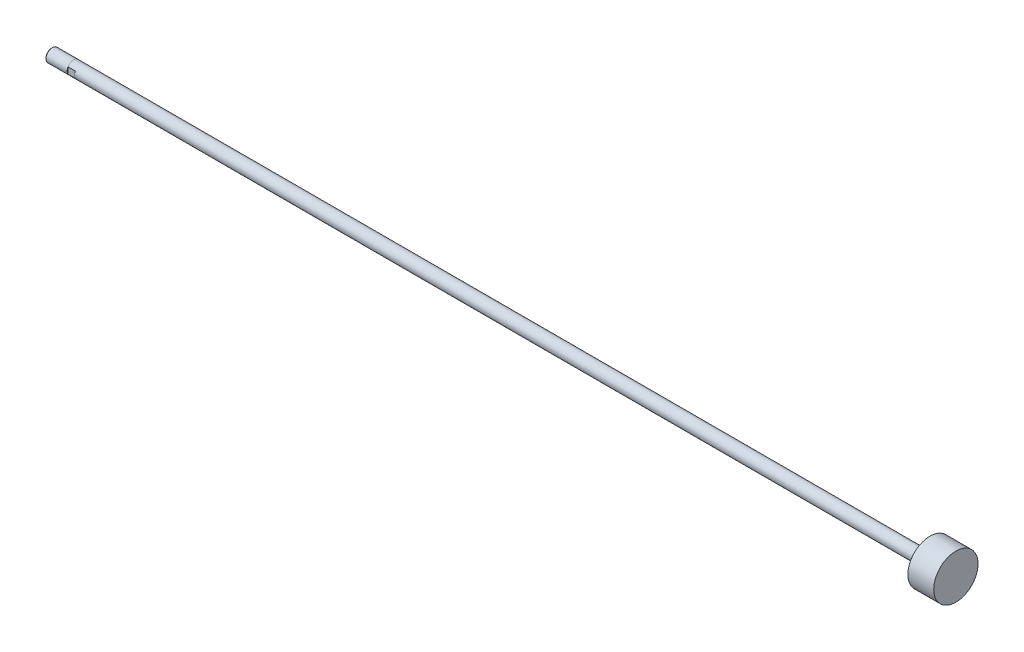
ISO-10303-21;
HEADER;
FILE_DESCRIPTION(('STEP AP214'),'2;1');
FILE_NAME('part.step','',(''),(''),'','','');
FILE_SCHEMA(('AUTOMOTIVE_DESIGN { 1 0 10303 214 1 1 1 1 }'));
ENDSEC;
DATA;
#1=APPLICATION_CONTEXT('core data for automotive mechanical design processes');
#2=APPLICATION_PROTOCOL_DEFINITION('international standard','automotive_design',2000,#1);
#3=PRODUCT_CONTEXT('',#1,'mechanical');
#4=PRODUCT('Part','Part','',(#3));
#5=PRODUCT_RELATED_PRODUCT_CATEGORY('part','',(#4));
#6=PRODUCT_DEFINITION_FORMATION('','',#4);
#7=PRODUCT_DEFINITION_CONTEXT('part definition',#1,'design');
#8=PRODUCT_DEFINITION('design','',#6,#7);
#9=PRODUCT_DEFINITION_SHAPE('','',#8);
#10=(LENGTH_UNIT() NAMED_UNIT(*) SI_UNIT(.MILLI.,.METRE.));
#11=(NAMED_UNIT(*) PLANE_ANGLE_UNIT() SI_UNIT($,.RADIAN.));
#12=(NAMED_UNIT(*) SI_UNIT($,.STERADIAN.) SOLID_ANGLE_UNIT());
#13=UNCERTAINTY_MEASURE_WITH_UNIT(LENGTH_MEASURE(1.E-05),#10,'distance_accuracy_value','');
#14=(GEOMETRIC_REPRESENTATION_CONTEXT(3) GLOBAL_UNCERTAINTY_ASSIGNED_CONTEXT((#13)) GLOBAL_UNIT_ASSIGNED_CONTEXT((#10,
#11,#12)) REPRESENTATION_CONTEXT('',''));
#15=CARTESIAN_POINT('',(0.,0.,0.));
#16=DIRECTION('',(0.,0.,1.));
#17=DIRECTION('',(1.,0.,0.));
#18=AXIS2_PLACEMENT_3D('',#15,#16,#17);
#19=CARTESIAN_POINT('',(-25.4,0.,0.));
#20=DIRECTION('',(1.,0.,0.));
#21=DIRECTION('',(0.,0.,-1.));
#22=AXIS2_PLACEMENT_3D('',#19,#20,#21);
#23=PLANE('',#22);
#24=CARTESIAN_POINT('',(-25.3999999999905,0.,0.));
#25=DIRECTION('',(1.,0.,0.));
#26=DIRECTION('',(0.,0.,-1.));
#27=AXIS2_PLACEMENT_3D('',#24,#25,#26);
#28=CIRCLE('',#27,4.80060000006688);
#29=CARTESIAN_POINT('',(-25.3999999999905,0.,-4.80060000006688));
#30=VERTEX_POINT('',#29);
#31=EDGE_CURVE('E20',#30,#30,#28,.T.);
#32=ORIENTED_EDGE('',*,*,#31,.F.);
#33=EDGE_LOOP('',(#32));
#34=FACE_BOUND('',#33,.T.);
#35=ADVANCED_FACE('F17',(#34),#23,.F.);
#36=CARTESIAN_POINT('',(755.777,19.14525,0.));
#37=DIRECTION('',(-1.,0.,0.));
#38=DIRECTION('',(0.,0.,1.));
#39=AXIS2_PLACEMENT_3D('',#36,#37,#38);
#40=PLANE('',#39);
#41=CARTESIAN_POINT('',(755.777,0.,0.));
#42=DIRECTION('',(-1.,0.,0.));
#43=DIRECTION('',(0.,0.,1.));
#44=AXIS2_PLACEMENT_3D('',#41,#42,#43);
#45=CIRCLE('',#44,19.14525);
#46=CARTESIAN_POINT('',(755.777,0.,19.14525));
#47=VERTEX_POINT('',#46);
#48=EDGE_CURVE('E92',#47,#47,#45,.T.);
#49=ORIENTED_EDGE('',*,*,#48,.F.);
#50=EDGE_LOOP('',(#49));
#51=FACE_BOUND('',#50,.T.);
#52=ADVANCED_FACE('F105',(#51),#40,.F.);
#53=CARTESIAN_POINT('',(-24.6443500000169,0.,0.));
#54=DIRECTION('',(1.,0.,0.));
#55=DIRECTION('',(0.,0.,-1.));
#56=AXIS2_PLACEMENT_3D('',#53,#54,#55);
#57=CONICAL_SURFACE('',#56,5.55625000004056,0.785398163397448);
#58=ORIENTED_EDGE('',*,*,#31,.T.);
#59=EDGE_LOOP('',(#58));
#60=FACE_BOUND('',#59,.T.);
#61=CARTESIAN_POINT('',(-24.64435,0.,0.));
#62=DIRECTION('',(-1.,0.,0.));
#63=DIRECTION('',(0.,0.,1.));
#64=AXIS2_PLACEMENT_3D('',#61,#62,#63);
#65=CIRCLE('',#64,5.55625);
#66=CARTESIAN_POINT('',(-24.64435,0.,5.55625));
#67=VERTEX_POINT('',#66);
#68=EDGE_CURVE('E91',#67,#67,#65,.F.);
#69=ORIENTED_EDGE('',*,*,#68,.F.);
#70=EDGE_LOOP('',(#69));
#71=FACE_BOUND('',#70,.T.);
#72=ADVANCED_FACE('F101',(#60,#71),#57,.T.);
#73=CARTESIAN_POINT('',(755.777,0.,0.));
#74=DIRECTION('',(-1.,0.,0.));
#75=DIRECTION('',(0.,0.,1.));
#76=AXIS2_PLACEMENT_3D('',#73,#74,#75);
#77=CYLINDRICAL_SURFACE('',#76,19.14525);
#78=CARTESIAN_POINT('',(733.425,0.,0.));
#79=DIRECTION('',(-1.,0.,0.));
#80=DIRECTION('',(0.,0.,1.));
#81=AXIS2_PLACEMENT_3D('',#78,#79,#80);
#82=CIRCLE('',#81,19.14525);
#83=CARTESIAN_POINT('',(733.425,0.,19.14525));
#84=VERTEX_POINT('',#83);
#85=EDGE_CURVE('E89',#84,#84,#82,.F.);
#86=ORIENTED_EDGE('',*,*,#85,.T.);
#87=EDGE_LOOP('',(#86));
#88=FACE_BOUND('',#87,.T.);
#89=ORIENTED_EDGE('',*,*,#48,.T.);
#90=EDGE_LOOP('',(#89));
#91=FACE_BOUND('',#90,.T.);
#92=ADVANCED_FACE('F139',(#88,#91),#77,.T.);
#93=CARTESIAN_POINT('',(-6.35,0.,0.));
#94=DIRECTION('',(-1.,0.,0.));
#95=DIRECTION('',(0.,0.,1.));
#96=AXIS2_PLACEMENT_3D('',#93,#94,#95);
#97=CYLINDRICAL_SURFACE('',#96,5.55625);
#98=ORIENTED_EDGE('',*,*,#68,.T.);
#99=EDGE_LOOP('',(#98));
#100=FACE_BOUND('',#99,.T.);
#101=CARTESIAN_POINT('',(-6.35,0.,0.));
#102=DIRECTION('',(-1.,0.,0.));
#103=DIRECTION('',(0.,0.,1.));
#104=AXIS2_PLACEMENT_3D('',#101,#102,#103);
#105=CIRCLE('',#104,5.55625);
#106=CARTESIAN_POINT('',(-6.35,0.,5.55625));
#107=VERTEX_POINT('',#106);
#108=EDGE_CURVE('E65',#107,#107,#105,.T.);
#109=ORIENTED_EDGE('',*,*,#108,.T.);
#110=EDGE_LOOP('',(#109));
#111=FACE_BOUND('',#110,.T.);
#112=ADVANCED_FACE('F135',(#100,#111),#97,.T.);
#113=CARTESIAN_POINT('',(733.425,5.5499,0.));
#114=DIRECTION('',(1.,0.,0.));
#115=DIRECTION('',(0.,0.,-1.));
#116=AXIS2_PLACEMENT_3D('',#113,#114,#115);
#117=PLANE('',#116);
#118=CARTESIAN_POINT('',(733.425,0.,0.));
#119=DIRECTION('',(-1.,0.,0.));
#120=DIRECTION('',(0.,0.,1.));
#121=AXIS2_PLACEMENT_3D('',#118,#119,#120);
#122=CIRCLE('',#121,5.5499);
#123=CARTESIAN_POINT('',(733.425,0.,5.5499));
#124=VERTEX_POINT('',#123);
#125=EDGE_CURVE('E79',#124,#124,#122,.T.);
#126=ORIENTED_EDGE('',*,*,#125,.F.);
#127=EDGE_LOOP('',(#126));
#128=FACE_BOUND('',#127,.T.);
#129=ORIENTED_EDGE('',*,*,#85,.F.);
#130=EDGE_LOOP('',(#129));
#131=FACE_BOUND('',#130,.T.);
#132=ADVANCED_FACE('F131',(#128,#131),#117,.F.);
#133=CARTESIAN_POINT('',(0.,0.,0.));
#134=DIRECTION('',(1.,0.,0.));
#135=DIRECTION('',(0.,0.,-1.));
#136=AXIS2_PLACEMENT_3D('',#133,#134,#135);
#137=PLANE('',#136);
#138=CARTESIAN_POINT('',(0.,0.,0.));
#139=DIRECTION('',(-1.,0.,0.));
#140=DIRECTION('',(0.,0.,1.));
#141=AXIS2_PLACEMENT_3D('',#138,#139,#140);
#142=CIRCLE('',#141,5.5499);
#143=CARTESIAN_POINT('',(0.,2.74064116768321,4.826));
#144=VERTEX_POINT('',#143);
#145=CARTESIAN_POINT('',(0.,-2.74064116768321,4.826));
#146=VERTEX_POINT('',#145);
#147=EDGE_CURVE('E74',#144,#146,#142,.F.);
#148=ORIENTED_EDGE('',*,*,#147,.F.);
#149=DIRECTION('',(0.,1.,0.));
#150=VECTOR('',#149,1.);
#151=CARTESIAN_POINT('',(0.,5.5499,4.826));
#152=LINE('',#151,#150);
#153=EDGE_CURVE('E66',#144,#146,#152,.F.);
#154=ORIENTED_EDGE('',*,*,#153,.T.);
#155=EDGE_LOOP('',(#148,#154));
#156=FACE_BOUND('',#155,.T.);
#157=ADVANCED_FACE('F128',(#156),#137,.F.);
#158=CARTESIAN_POINT('',(0.,5.5499,4.826));
#159=DIRECTION('',(0.,0.,-1.));
#160=DIRECTION('',(-1.,0.,0.));
#161=AXIS2_PLACEMENT_3D('',#158,#159,#160);
#162=PLANE('',#161);
#163=DIRECTION('',(-1.,0.,0.));
#164=VECTOR('',#163,1.);
#165=CARTESIAN_POINT('',(755.777,-2.74064116768321,4.826));
#166=LINE('',#165,#164);
#167=CARTESIAN_POINT('',(-6.34999999999998,-2.74064116768321,4.826));
#168=VERTEX_POINT('',#167);
#169=EDGE_CURVE('E252',#146,#168,#166,.T.);
#170=ORIENTED_EDGE('',*,*,#169,.F.);
#171=ORIENTED_EDGE('',*,*,#153,.F.);
#172=DIRECTION('',(-1.,0.,0.));
#173=VECTOR('',#172,1.);
#174=CARTESIAN_POINT('',(755.777,2.74064116768321,4.826));
#175=LINE('',#174,#173);
#176=CARTESIAN_POINT('',(-6.34999999999998,2.74064116768321,4.826));
#177=VERTEX_POINT('',#176);
#178=EDGE_CURVE('E69',#177,#144,#175,.F.);
#179=ORIENTED_EDGE('',*,*,#178,.F.);
#180=DIRECTION('',(0.,1.,0.));
#181=VECTOR('',#180,1.);
#182=CARTESIAN_POINT('',(-6.35,5.55625,4.826));
#183=LINE('',#182,#181);
#184=EDGE_CURVE('E57',#177,#168,#183,.F.);
#185=ORIENTED_EDGE('',*,*,#184,.T.);
#186=EDGE_LOOP('',(#170,#171,#179,#185));
#187=FACE_BOUND('',#186,.T.);
#188=ADVANCED_FACE('F70',(#187),#162,.F.);
#189=CARTESIAN_POINT('',(-6.35,5.55625,0.));
#190=DIRECTION('',(-1.,0.,0.));
#191=DIRECTION('',(0.,0.,1.));
#192=AXIS2_PLACEMENT_3D('',#189,#190,#191);
#193=PLANE('',#192);
#194=ORIENTED_EDGE('',*,*,#108,.F.);
#195=EDGE_LOOP('',(#194));
#196=FACE_BOUND('',#195,.T.);
#197=DIRECTION('',(0.,1.,0.));
#198=VECTOR('',#197,1.);
#199=CARTESIAN_POINT('',(-6.35,-5.5499,-4.826));
#200=LINE('',#199,#198);
#201=CARTESIAN_POINT('',(-6.34999999999998,2.74064116768321,-4.826));
#202=VERTEX_POINT('',#201);
#203=CARTESIAN_POINT('',(-6.34999999999998,-2.74064116768321,-4.826));
#204=VERTEX_POINT('',#203);
#205=EDGE_CURVE('E82',#202,#204,#200,.F.);
#206=ORIENTED_EDGE('',*,*,#205,.T.);
#207=CARTESIAN_POINT('',(-6.34999999999997,0.,0.));
#208=DIRECTION('',(-1.,0.,0.));
#209=DIRECTION('',(0.,0.,1.));
#210=AXIS2_PLACEMENT_3D('',#207,#208,#209);
#211=CIRCLE('',#210,5.5499);
#212=EDGE_CURVE('E61',#168,#204,#211,.F.);
#213=ORIENTED_EDGE('',*,*,#212,.F.);
#214=ORIENTED_EDGE('',*,*,#184,.F.);
#215=CARTESIAN_POINT('',(-6.34999999999997,0.,0.));
#216=DIRECTION('',(-1.,0.,0.));
#217=DIRECTION('',(0.,0.,1.));
#218=AXIS2_PLACEMENT_3D('',#215,#216,#217);
#219=CIRCLE('',#218,5.5499);
#220=EDGE_CURVE('E54',#202,#177,#219,.F.);
#221=ORIENTED_EDGE('',*,*,#220,.F.);
#222=EDGE_LOOP('',(#206,#213,#214,#221));
#223=FACE_BOUND('',#222,.T.);
#224=ADVANCED_FACE('F59',(#196,#223),#193,.F.);
#225=CARTESIAN_POINT('',(0.,0.,0.));
#226=DIRECTION('',(1.,0.,0.));
#227=DIRECTION('',(0.,0.,-1.));
#228=AXIS2_PLACEMENT_3D('',#225,#226,#227);
#229=PLANE('',#228);
#230=CARTESIAN_POINT('',(0.,0.,0.));
#231=DIRECTION('',(-1.,0.,0.));
#232=DIRECTION('',(0.,0.,1.));
#233=AXIS2_PLACEMENT_3D('',#230,#231,#232);
#234=CIRCLE('',#233,5.5499);
#235=CARTESIAN_POINT('',(0.,-2.74064116768321,-4.826));
#236=VERTEX_POINT('',#235);
#237=CARTESIAN_POINT('',(0.,2.74064116768321,-4.826));
#238=VERTEX_POINT('',#237);
#239=EDGE_CURVE('E26',#236,#238,#234,.F.);
#240=ORIENTED_EDGE('',*,*,#239,.F.);
#241=DIRECTION('',(0.,1.,0.));
#242=VECTOR('',#241,1.);
#243=CARTESIAN_POINT('',(0.,-5.5499,-4.826));
#244=LINE('',#243,#242);
#245=EDGE_CURVE('E34',#236,#238,#244,.T.);
#246=ORIENTED_EDGE('',*,*,#245,.T.);
#247=EDGE_LOOP('',(#240,#246));
#248=FACE_BOUND('',#247,.T.);
#249=ADVANCED_FACE('F117',(#248),#229,.F.);
#250=CARTESIAN_POINT('',(0.,-5.5499,-4.826));
#251=DIRECTION('',(0.,0.,1.));
#252=DIRECTION('',(1.,0.,0.));
#253=AXIS2_PLACEMENT_3D('',#250,#251,#252);
#254=PLANE('',#253);
#255=DIRECTION('',(-1.,0.,0.));
#256=VECTOR('',#255,1.);
#257=CARTESIAN_POINT('',(755.777,2.74064116768321,-4.826));
#258=LINE('',#257,#256);
#259=EDGE_CURVE('E11',#238,#202,#258,.T.);
#260=ORIENTED_EDGE('',*,*,#259,.F.);
#261=ORIENTED_EDGE('',*,*,#245,.F.);
#262=DIRECTION('',(-1.,0.,0.));
#263=VECTOR('',#262,1.);
#264=CARTESIAN_POINT('',(755.777,-2.74064116768321,-4.826));
#265=LINE('',#264,#263);
#266=EDGE_CURVE('E254',#204,#236,#265,.F.);
#267=ORIENTED_EDGE('',*,*,#266,.F.);
#268=ORIENTED_EDGE('',*,*,#205,.F.);
#269=EDGE_LOOP('',(#260,#261,#267,#268));
#270=FACE_BOUND('',#269,.T.);
#271=ADVANCED_FACE('F112',(#270),#254,.F.);
#272=CARTESIAN_POINT('',(755.777,0.,0.));
#273=DIRECTION('',(-1.,0.,0.));
#274=DIRECTION('',(0.,0.,1.));
#275=AXIS2_PLACEMENT_3D('',#272,#273,#274);
#276=CYLINDRICAL_SURFACE('',#275,5.5499);
#277=ORIENTED_EDGE('',*,*,#239,.T.);
#278=ORIENTED_EDGE('',*,*,#259,.T.);
#279=ORIENTED_EDGE('',*,*,#220,.T.);
#280=ORIENTED_EDGE('',*,*,#178,.T.);
#281=ORIENTED_EDGE('',*,*,#147,.T.);
#282=ORIENTED_EDGE('',*,*,#169,.T.);
#283=ORIENTED_EDGE('',*,*,#212,.T.);
#284=ORIENTED_EDGE('',*,*,#266,.T.);
#285=EDGE_LOOP('',(#277,#278,#279,#280,#281,#282,#283,#284));
#286=FACE_BOUND('',#285,.T.);
#287=ORIENTED_EDGE('',*,*,#125,.T.);
#288=EDGE_LOOP('',(#287));
#289=FACE_BOUND('',#288,.T.);
#290=ADVANCED_FACE('F77',(#286,#289),#276,.T.);
#291=CLOSED_SHELL('',(#35,#52,#72,#92,#112,#132,#157,#188,#224,#249,#271,#290));
#292=MANIFOLD_SOLID_BREP('B1',#291);
#293=ADVANCED_BREP_SHAPE_REPRESENTATION('',(#18,#292),#14);
#294=SHAPE_DEFINITION_REPRESENTATION(#9,#293);
ENDSEC;
END-ISO-10303-21;
